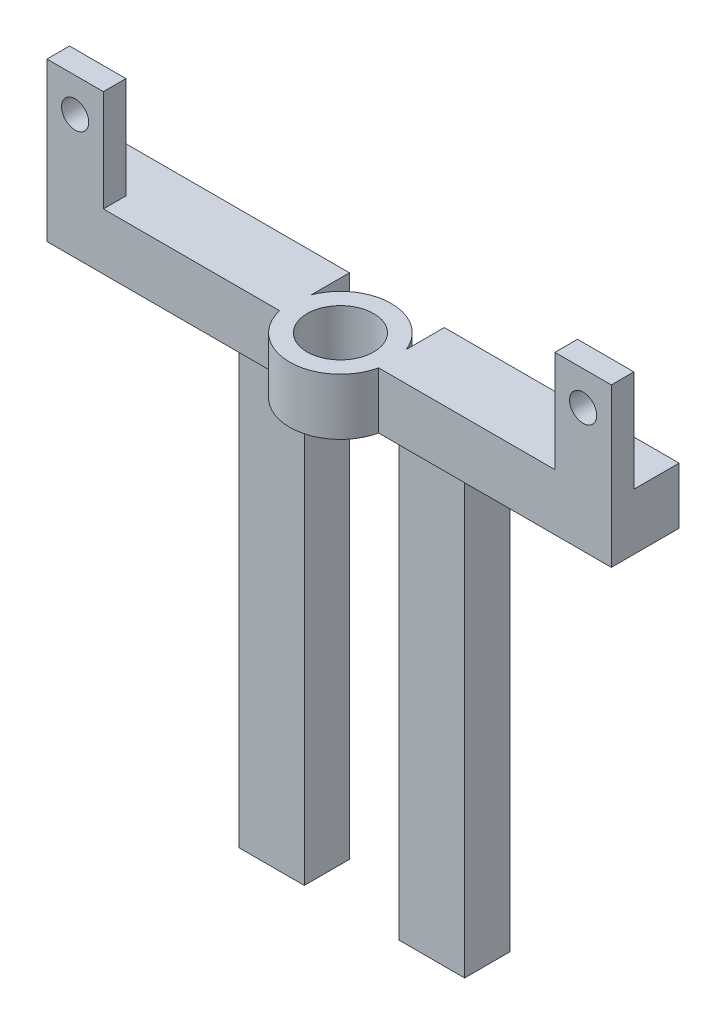
ISO-10303-21;
HEADER;
FILE_DESCRIPTION(('STEP AP214'),'2;1');
FILE_NAME('part.step','',(''),(''),'','','');
FILE_SCHEMA(('AUTOMOTIVE_DESIGN { 1 0 10303 214 1 1 1 1 }'));
ENDSEC;
DATA;
#1=APPLICATION_CONTEXT('core data for automotive mechanical design processes');
#2=APPLICATION_PROTOCOL_DEFINITION('international standard','automotive_design',2000,#1);
#3=PRODUCT_CONTEXT('',#1,'mechanical');
#4=PRODUCT('Part','Part','',(#3));
#5=PRODUCT_RELATED_PRODUCT_CATEGORY('part','',(#4));
#6=PRODUCT_DEFINITION_FORMATION('','',#4);
#7=PRODUCT_DEFINITION_CONTEXT('part definition',#1,'design');
#8=PRODUCT_DEFINITION('design','',#6,#7);
#9=PRODUCT_DEFINITION_SHAPE('','',#8);
#10=(LENGTH_UNIT() NAMED_UNIT(*) SI_UNIT(.MILLI.,.METRE.));
#11=(NAMED_UNIT(*) PLANE_ANGLE_UNIT() SI_UNIT($,.RADIAN.));
#12=(NAMED_UNIT(*) SI_UNIT($,.STERADIAN.) SOLID_ANGLE_UNIT());
#13=UNCERTAINTY_MEASURE_WITH_UNIT(LENGTH_MEASURE(1.E-05),#10,'distance_accuracy_value','');
#14=(GEOMETRIC_REPRESENTATION_CONTEXT(3) GLOBAL_UNCERTAINTY_ASSIGNED_CONTEXT((#13)) GLOBAL_UNIT_ASSIGNED_CONTEXT((#10,
#11,#12)) REPRESENTATION_CONTEXT('',''));
#15=CARTESIAN_POINT('',(0.,0.,0.));
#16=DIRECTION('',(0.,0.,1.));
#17=DIRECTION('',(1.,0.,0.));
#18=AXIS2_PLACEMENT_3D('',#15,#16,#17);
#19=CARTESIAN_POINT('',(0.,0.,0.));
#20=DIRECTION('',(0.,0.,1.));
#21=DIRECTION('',(1.,0.,0.));
#22=AXIS2_PLACEMENT_3D('',#19,#20,#21);
#23=PLANE('',#22);
#24=CARTESIAN_POINT('',(-22.5,-20.75,0.));
#25=DIRECTION('',(0.,0.,1.));
#26=DIRECTION('',(1.,0.,0.));
#27=AXIS2_PLACEMENT_3D('',#24,#25,#26);
#28=CIRCLE('',#27,1.2);
#29=CARTESIAN_POINT('',(-21.3,-20.75,0.));
#30=VERTEX_POINT('',#29);
#31=EDGE_CURVE('E304',#30,#30,#28,.T.);
#32=ORIENTED_EDGE('',*,*,#31,.T.);
#33=EDGE_LOOP('',(#32));
#34=FACE_BOUND('',#33,.T.);
#35=DIRECTION('',(1.,0.,0.));
#36=VECTOR('',#35,1.);
#37=CARTESIAN_POINT('',(0.,-26.75,0.));
#38=LINE('',#37,#36);
#39=CARTESIAN_POINT('',(-25.,-26.75,0.));
#40=VERTEX_POINT('',#39);
#41=CARTESIAN_POINT('',(-20.,-26.75,0.));
#42=VERTEX_POINT('',#41);
#43=EDGE_CURVE('E267',#40,#42,#38,.T.);
#44=ORIENTED_EDGE('',*,*,#43,.F.);
#45=DIRECTION('',(0.,1.,0.));
#46=VECTOR('',#45,1.);
#47=CARTESIAN_POINT('',(-25.,0.,0.));
#48=LINE('',#47,#46);
#49=CARTESIAN_POINT('',(-25.,-17.75,0.));
#50=VERTEX_POINT('',#49);
#51=EDGE_CURVE('E357',#40,#50,#48,.T.);
#52=ORIENTED_EDGE('',*,*,#51,.T.);
#53=DIRECTION('',(1.,0.,0.));
#54=VECTOR('',#53,1.);
#55=CARTESIAN_POINT('',(0.,-17.75,0.));
#56=LINE('',#55,#54);
#57=CARTESIAN_POINT('',(-20.,-17.75,0.));
#58=VERTEX_POINT('',#57);
#59=EDGE_CURVE('E321',#50,#58,#56,.T.);
#60=ORIENTED_EDGE('',*,*,#59,.T.);
#61=DIRECTION('',(0.,-1.,0.));
#62=VECTOR('',#61,1.);
#63=CARTESIAN_POINT('',(-20.,0.,0.));
#64=LINE('',#63,#62);
#65=EDGE_CURVE('E314',#58,#42,#64,.T.);
#66=ORIENTED_EDGE('',*,*,#65,.T.);
#67=EDGE_LOOP('',(#44,#52,#60,#66));
#68=FACE_BOUND('',#67,.T.);
#69=ADVANCED_FACE('F39',(#34,#68),#23,.F.);
#70=CARTESIAN_POINT('',(0.,0.,2.));
#71=DIRECTION('',(0.,0.,1.));
#72=DIRECTION('',(1.,0.,0.));
#73=AXIS2_PLACEMENT_3D('',#70,#71,#72);
#74=PLANE('',#73);
#75=DIRECTION('',(0.,1.,0.));
#76=VECTOR('',#75,1.);
#77=CARTESIAN_POINT('',(4.38748219369606,-44.4779220613579,2.));
#78=LINE('',#77,#76);
#79=CARTESIAN_POINT('',(4.38748219369607,-31.75,2.));
#80=VERTEX_POINT('',#79);
#81=CARTESIAN_POINT('',(4.38748219369607,-26.75,2.));
#82=VERTEX_POINT('',#81);
#83=EDGE_CURVE('E301',#80,#82,#78,.T.);
#84=ORIENTED_EDGE('',*,*,#83,.F.);
#85=DIRECTION('',(-1.,0.,0.));
#86=VECTOR('',#85,1.);
#87=CARTESIAN_POINT('',(0.,-31.75,2.));
#88=LINE('',#87,#86);
#89=CARTESIAN_POINT('',(25.,-31.75,2.));
#90=VERTEX_POINT('',#89);
#91=EDGE_CURVE('E335',#90,#80,#88,.T.);
#92=ORIENTED_EDGE('',*,*,#91,.F.);
#93=DIRECTION('',(0.,-1.,0.));
#94=VECTOR('',#93,1.);
#95=CARTESIAN_POINT('',(25.,0.,2.));
#96=LINE('',#95,#94);
#97=CARTESIAN_POINT('',(25.,-17.75,2.));
#98=VERTEX_POINT('',#97);
#99=EDGE_CURVE('E331',#98,#90,#96,.T.);
#100=ORIENTED_EDGE('',*,*,#99,.F.);
#101=DIRECTION('',(1.,0.,0.));
#102=VECTOR('',#101,1.);
#103=CARTESIAN_POINT('',(0.,-17.75,2.));
#104=LINE('',#103,#102);
#105=CARTESIAN_POINT('',(20.,-17.75,2.));
#106=VERTEX_POINT('',#105);
#107=EDGE_CURVE('E328',#106,#98,#104,.T.);
#108=ORIENTED_EDGE('',*,*,#107,.F.);
#109=DIRECTION('',(0.,1.,0.));
#110=VECTOR('',#109,1.);
#111=CARTESIAN_POINT('',(20.,0.,2.));
#112=LINE('',#111,#110);
#113=CARTESIAN_POINT('',(20.,-26.75,2.));
#114=VERTEX_POINT('',#113);
#115=EDGE_CURVE('E325',#114,#106,#112,.T.);
#116=ORIENTED_EDGE('',*,*,#115,.F.);
#117=DIRECTION('',(1.,0.,0.));
#118=VECTOR('',#117,1.);
#119=CARTESIAN_POINT('',(0.,-26.75,2.));
#120=LINE('',#119,#118);
#121=EDGE_CURVE('E320',#82,#114,#120,.T.);
#122=ORIENTED_EDGE('',*,*,#121,.F.);
#123=EDGE_LOOP('',(#84,#92,#100,#108,#116,#122));
#124=FACE_BOUND('',#123,.T.);
#125=CARTESIAN_POINT('',(22.5,-20.75,2.));
#126=DIRECTION('',(0.,0.,1.));
#127=DIRECTION('',(1.,0.,0.));
#128=AXIS2_PLACEMENT_3D('',#125,#126,#127);
#129=CIRCLE('',#128,1.2);
#130=CARTESIAN_POINT('',(23.7,-20.75,2.));
#131=VERTEX_POINT('',#130);
#132=EDGE_CURVE('E311',#131,#131,#129,.T.);
#133=ORIENTED_EDGE('',*,*,#132,.F.);
#134=EDGE_LOOP('',(#133));
#135=FACE_BOUND('',#134,.T.);
#136=ADVANCED_FACE('F404',(#124,#135),#74,.T.);
#137=CARTESIAN_POINT('',(22.5,-20.75,0.));
#138=DIRECTION('',(0.,0.,1.));
#139=DIRECTION('',(1.,0.,0.));
#140=AXIS2_PLACEMENT_3D('',#137,#138,#139);
#141=CIRCLE('',#140,1.2);
#142=CARTESIAN_POINT('',(23.7,-20.75,0.));
#143=VERTEX_POINT('',#142);
#144=EDGE_CURVE('E308',#143,#143,#141,.T.);
#145=ORIENTED_EDGE('',*,*,#144,.T.);
#146=EDGE_LOOP('',(#145));
#147=FACE_BOUND('',#146,.T.);
#148=DIRECTION('',(0.,-1.,0.));
#149=VECTOR('',#148,1.);
#150=CARTESIAN_POINT('',(25.,0.,0.));
#151=LINE('',#150,#149);
#152=CARTESIAN_POINT('',(25.,-17.75,0.));
#153=VERTEX_POINT('',#152);
#154=CARTESIAN_POINT('',(25.,-26.75,0.));
#155=VERTEX_POINT('',#154);
#156=EDGE_CURVE('E353',#153,#155,#151,.T.);
#157=ORIENTED_EDGE('',*,*,#156,.T.);
#158=DIRECTION('',(-1.,0.,0.));
#159=VECTOR('',#158,1.);
#160=CARTESIAN_POINT('',(0.,-26.75,0.));
#161=LINE('',#160,#159);
#162=CARTESIAN_POINT('',(20.,-26.75,0.));
#163=VERTEX_POINT('',#162);
#164=EDGE_CURVE('E263',#155,#163,#161,.T.);
#165=ORIENTED_EDGE('',*,*,#164,.T.);
#166=DIRECTION('',(0.,1.,0.));
#167=VECTOR('',#166,1.);
#168=CARTESIAN_POINT('',(20.,0.,0.));
#169=LINE('',#168,#167);
#170=CARTESIAN_POINT('',(20.,-17.75,0.));
#171=VERTEX_POINT('',#170);
#172=EDGE_CURVE('E347',#163,#171,#169,.T.);
#173=ORIENTED_EDGE('',*,*,#172,.T.);
#174=DIRECTION('',(1.,0.,0.));
#175=VECTOR('',#174,1.);
#176=CARTESIAN_POINT('',(0.,-17.75,0.));
#177=LINE('',#176,#175);
#178=EDGE_CURVE('E350',#171,#153,#177,.T.);
#179=ORIENTED_EDGE('',*,*,#178,.T.);
#180=EDGE_LOOP('',(#157,#165,#173,#179));
#181=FACE_BOUND('',#180,.T.);
#182=ADVANCED_FACE('F419',(#147,#181),#23,.F.);
#183=DIRECTION('',(0.,1.,0.));
#184=VECTOR('',#183,1.);
#185=CARTESIAN_POINT('',(-4.38748219369606,-44.4779220613579,2.));
#186=LINE('',#185,#184);
#187=CARTESIAN_POINT('',(-4.38748219369606,-26.75,2.));
#188=VERTEX_POINT('',#187);
#189=CARTESIAN_POINT('',(-4.38748219369606,-31.75,2.));
#190=VERTEX_POINT('',#189);
#191=EDGE_CURVE('E298',#188,#190,#186,.F.);
#192=ORIENTED_EDGE('',*,*,#191,.F.);
#193=CARTESIAN_POINT('',(-20.,-26.75,2.));
#194=VERTEX_POINT('',#193);
#195=EDGE_CURVE('E322',#194,#188,#120,.T.);
#196=ORIENTED_EDGE('',*,*,#195,.F.);
#197=DIRECTION('',(0.,-1.,0.));
#198=VECTOR('',#197,1.);
#199=CARTESIAN_POINT('',(-20.,0.,2.));
#200=LINE('',#199,#198);
#201=CARTESIAN_POINT('',(-20.,-17.75,2.));
#202=VERTEX_POINT('',#201);
#203=EDGE_CURVE('E317',#202,#194,#200,.T.);
#204=ORIENTED_EDGE('',*,*,#203,.F.);
#205=DIRECTION('',(1.,0.,0.));
#206=VECTOR('',#205,1.);
#207=CARTESIAN_POINT('',(0.,-17.75,2.));
#208=LINE('',#207,#206);
#209=CARTESIAN_POINT('',(-25.,-17.75,2.));
#210=VERTEX_POINT('',#209);
#211=EDGE_CURVE('E341',#210,#202,#208,.T.);
#212=ORIENTED_EDGE('',*,*,#211,.F.);
#213=DIRECTION('',(0.,1.,0.));
#214=VECTOR('',#213,1.);
#215=CARTESIAN_POINT('',(-25.,0.,2.));
#216=LINE('',#215,#214);
#217=CARTESIAN_POINT('',(-25.,-31.75,2.));
#218=VERTEX_POINT('',#217);
#219=EDGE_CURVE('E338',#218,#210,#216,.T.);
#220=ORIENTED_EDGE('',*,*,#219,.F.);
#221=EDGE_CURVE('E334',#190,#218,#88,.T.);
#222=ORIENTED_EDGE('',*,*,#221,.F.);
#223=EDGE_LOOP('',(#192,#196,#204,#212,#220,#222));
#224=FACE_BOUND('',#223,.T.);
#225=CARTESIAN_POINT('',(-22.5,-20.75,2.));
#226=DIRECTION('',(0.,0.,1.));
#227=DIRECTION('',(1.,0.,0.));
#228=AXIS2_PLACEMENT_3D('',#225,#226,#227);
#229=CIRCLE('',#228,1.2);
#230=CARTESIAN_POINT('',(-21.3,-20.75,2.));
#231=VERTEX_POINT('',#230);
#232=EDGE_CURVE('E305',#231,#231,#229,.T.);
#233=ORIENTED_EDGE('',*,*,#232,.F.);
#234=EDGE_LOOP('',(#233));
#235=FACE_BOUND('',#234,.T.);
#236=ADVANCED_FACE('F421',(#224,#235),#74,.T.);
#237=CARTESIAN_POINT('',(-20.,0.,2.));
#238=DIRECTION('',(1.,0.,0.));
#239=DIRECTION('',(0.,0.,-1.));
#240=AXIS2_PLACEMENT_3D('',#237,#238,#239);
#241=PLANE('',#240);
#242=ORIENTED_EDGE('',*,*,#65,.F.);
#243=DIRECTION('',(0.,0.,-1.));
#244=VECTOR('',#243,1.);
#245=CARTESIAN_POINT('',(-20.,-17.75,2.));
#246=LINE('',#245,#244);
#247=EDGE_CURVE('E361',#202,#58,#246,.T.);
#248=ORIENTED_EDGE('',*,*,#247,.F.);
#249=ORIENTED_EDGE('',*,*,#203,.T.);
#250=DIRECTION('',(0.,0.,-1.));
#251=VECTOR('',#250,1.);
#252=CARTESIAN_POINT('',(-20.,-26.75,2.));
#253=LINE('',#252,#251);
#254=EDGE_CURVE('E344',#194,#42,#253,.T.);
#255=ORIENTED_EDGE('',*,*,#254,.T.);
#256=EDGE_LOOP('',(#242,#248,#249,#255));
#257=FACE_BOUND('',#256,.T.);
#258=ADVANCED_FACE('F41',(#257),#241,.T.);
#259=CARTESIAN_POINT('',(0.,-17.75,2.));
#260=DIRECTION('',(0.,1.,0.));
#261=DIRECTION('',(0.,0.,1.));
#262=AXIS2_PLACEMENT_3D('',#259,#260,#261);
#263=PLANE('',#262);
#264=ORIENTED_EDGE('',*,*,#59,.F.);
#265=DIRECTION('',(0.,0.,-1.));
#266=VECTOR('',#265,1.);
#267=CARTESIAN_POINT('',(-25.,-17.75,2.));
#268=LINE('',#267,#266);
#269=EDGE_CURVE('E363',#210,#50,#268,.T.);
#270=ORIENTED_EDGE('',*,*,#269,.F.);
#271=ORIENTED_EDGE('',*,*,#211,.T.);
#272=ORIENTED_EDGE('',*,*,#247,.T.);
#273=EDGE_LOOP('',(#264,#270,#271,#272));
#274=FACE_BOUND('',#273,.T.);
#275=ADVANCED_FACE('F449',(#274),#263,.T.);
#276=CARTESIAN_POINT('',(-25.,0.,2.));
#277=DIRECTION('',(-1.,0.,0.));
#278=DIRECTION('',(0.,-1.,0.));
#279=AXIS2_PLACEMENT_3D('',#276,#277,#278);
#280=PLANE('',#279);
#281=ORIENTED_EDGE('',*,*,#51,.F.);
#282=DIRECTION('',(0.,0.,1.));
#283=VECTOR('',#282,1.);
#284=CARTESIAN_POINT('',(-25.,-26.75,-19.8113883008419));
#285=LINE('',#284,#283);
#286=CARTESIAN_POINT('',(-25.,-26.75,-4.));
#287=VERTEX_POINT('',#286);
#288=EDGE_CURVE('E274',#287,#40,#285,.T.);
#289=ORIENTED_EDGE('',*,*,#288,.F.);
#290=DIRECTION('',(0.,-1.,0.));
#291=VECTOR('',#290,1.);
#292=CARTESIAN_POINT('',(-25.,0.,-4.));
#293=LINE('',#292,#291);
#294=CARTESIAN_POINT('',(-25.,-31.75,-4.));
#295=VERTEX_POINT('',#294);
#296=EDGE_CURVE('E283',#287,#295,#293,.T.);
#297=ORIENTED_EDGE('',*,*,#296,.T.);
#298=DIRECTION('',(0.,0.,-1.));
#299=VECTOR('',#298,1.);
#300=CARTESIAN_POINT('',(-25.,-31.75,2.));
#301=LINE('',#300,#299);
#302=EDGE_CURVE('E366',#218,#295,#301,.T.);
#303=ORIENTED_EDGE('',*,*,#302,.F.);
#304=ORIENTED_EDGE('',*,*,#219,.T.);
#305=ORIENTED_EDGE('',*,*,#269,.T.);
#306=EDGE_LOOP('',(#281,#289,#297,#303,#304,#305));
#307=FACE_BOUND('',#306,.T.);
#308=ADVANCED_FACE('F443',(#307),#280,.T.);
#309=CARTESIAN_POINT('',(0.,-31.75,2.));
#310=DIRECTION('',(0.,-1.,0.));
#311=DIRECTION('',(1.,0.,0.));
#312=AXIS2_PLACEMENT_3D('',#309,#310,#311);
#313=PLANE('',#312);
#314=DIRECTION('',(0.,0.,-1.));
#315=VECTOR('',#314,1.);
#316=CARTESIAN_POINT('',(4.2,-31.75,2.));
#317=LINE('',#316,#315);
#318=CARTESIAN_POINT('',(4.2,-31.75,0.));
#319=VERTEX_POINT('',#318);
#320=CARTESIAN_POINT('',(4.2,-31.75,-0.615549442140364));
#321=VERTEX_POINT('',#320);
#322=EDGE_CURVE('E254',#319,#321,#317,.T.);
#323=ORIENTED_EDGE('',*,*,#322,.F.);
#324=DIRECTION('',(-1.,0.,0.));
#325=VECTOR('',#324,1.);
#326=CARTESIAN_POINT('',(0.,-31.75,0.));
#327=LINE('',#326,#325);
#328=CARTESIAN_POINT('',(10.,-31.75,0.));
#329=VERTEX_POINT('',#328);
#330=EDGE_CURVE('E355',#329,#319,#327,.T.);
#331=ORIENTED_EDGE('',*,*,#330,.F.);
#332=DIRECTION('',(0.,0.,1.));
#333=VECTOR('',#332,1.);
#334=CARTESIAN_POINT('',(10.,-31.75,-19.8113883008419));
#335=LINE('',#334,#333);
#336=CARTESIAN_POINT('',(10.,-31.75,-4.));
#337=VERTEX_POINT('',#336);
#338=EDGE_CURVE('E193',#337,#329,#335,.T.);
#339=ORIENTED_EDGE('',*,*,#338,.F.);
#340=DIRECTION('',(-1.,0.,0.));
#341=VECTOR('',#340,1.);
#342=CARTESIAN_POINT('',(0.,-31.75,-4.));
#343=LINE('',#342,#341);
#344=CARTESIAN_POINT('',(25.,-31.75,-4.));
#345=VERTEX_POINT('',#344);
#346=EDGE_CURVE('E259',#345,#337,#343,.T.);
#347=ORIENTED_EDGE('',*,*,#346,.F.);
#348=DIRECTION('',(0.,0.,-1.));
#349=VECTOR('',#348,1.);
#350=CARTESIAN_POINT('',(25.,-31.75,2.));
#351=LINE('',#350,#349);
#352=EDGE_CURVE('E368',#90,#345,#351,.T.);
#353=ORIENTED_EDGE('',*,*,#352,.F.);
#354=ORIENTED_EDGE('',*,*,#91,.T.);
#355=CARTESIAN_POINT('',(0.,-31.75,1.));
#356=DIRECTION('',(0.,-1.,0.));
#357=DIRECTION('',(1.,0.,0.));
#358=AXIS2_PLACEMENT_3D('',#355,#356,#357);
#359=CIRCLE('',#358,4.5);
#360=EDGE_CURVE('E294',#190,#80,#359,.F.);
#361=ORIENTED_EDGE('',*,*,#360,.F.);
#362=ORIENTED_EDGE('',*,*,#221,.T.);
#363=ORIENTED_EDGE('',*,*,#302,.T.);
#364=DIRECTION('',(1.,0.,0.));
#365=VECTOR('',#364,1.);
#366=CARTESIAN_POINT('',(0.,-31.75,-4.));
#367=LINE('',#366,#365);
#368=CARTESIAN_POINT('',(-9.99999999999999,-31.75,-4.));
#369=VERTEX_POINT('',#368);
#370=EDGE_CURVE('E256',#295,#369,#367,.T.);
#371=ORIENTED_EDGE('',*,*,#370,.T.);
#372=DIRECTION('',(0.,0.,1.));
#373=VECTOR('',#372,1.);
#374=CARTESIAN_POINT('',(-9.99999999999999,-31.75,-19.8113883008419));
#375=LINE('',#374,#373);
#376=CARTESIAN_POINT('',(-9.99999999999999,-31.75,0.));
#377=VERTEX_POINT('',#376);
#378=EDGE_CURVE('E277',#369,#377,#375,.T.);
#379=ORIENTED_EDGE('',*,*,#378,.T.);
#380=CARTESIAN_POINT('',(-4.19999999999999,-31.75,0.));
#381=VERTEX_POINT('',#380);
#382=EDGE_CURVE('E54',#381,#377,#327,.T.);
#383=ORIENTED_EDGE('',*,*,#382,.F.);
#384=DIRECTION('',(0.,0.,1.));
#385=VECTOR('',#384,1.);
#386=CARTESIAN_POINT('',(-4.19999999999999,-31.75,2.));
#387=LINE('',#386,#385);
#388=CARTESIAN_POINT('',(-4.19999999999999,-31.75,-0.615549442140364));
#389=VERTEX_POINT('',#388);
#390=EDGE_CURVE('E222',#389,#381,#387,.T.);
#391=ORIENTED_EDGE('',*,*,#390,.F.);
#392=EDGE_CURVE('E296',#321,#389,#359,.F.);
#393=ORIENTED_EDGE('',*,*,#392,.F.);
#394=EDGE_LOOP('',(#323,#331,#339,#347,#353,#354,#361,#362,#363,#371,#379,#383,#391,#393));
#395=FACE_BOUND('',#394,.T.);
#396=CARTESIAN_POINT('',(0.,-31.75,1.));
#397=DIRECTION('',(0.,1.,0.));
#398=DIRECTION('',(0.,0.,1.));
#399=AXIS2_PLACEMENT_3D('',#396,#397,#398);
#400=CIRCLE('',#399,2.95);
#401=CARTESIAN_POINT('',(0.,-31.75,3.95));
#402=VERTEX_POINT('',#401);
#403=EDGE_CURVE('E273',#402,#402,#400,.T.);
#404=ORIENTED_EDGE('',*,*,#403,.T.);
#405=EDGE_LOOP('',(#404));
#406=FACE_BOUND('',#405,.T.);
#407=ADVANCED_FACE('F391',(#395,#406),#313,.T.);
#408=CARTESIAN_POINT('',(25.,0.,2.));
#409=DIRECTION('',(1.,0.,0.));
#410=DIRECTION('',(0.,1.,0.));
#411=AXIS2_PLACEMENT_3D('',#408,#409,#410);
#412=PLANE('',#411);
#413=ORIENTED_EDGE('',*,*,#156,.F.);
#414=DIRECTION('',(0.,0.,-1.));
#415=VECTOR('',#414,1.);
#416=CARTESIAN_POINT('',(25.,-17.75,2.));
#417=LINE('',#416,#415);
#418=EDGE_CURVE('E370',#98,#153,#417,.T.);
#419=ORIENTED_EDGE('',*,*,#418,.F.);
#420=ORIENTED_EDGE('',*,*,#99,.T.);
#421=ORIENTED_EDGE('',*,*,#352,.T.);
#422=DIRECTION('',(0.,-1.,0.));
#423=VECTOR('',#422,1.);
#424=CARTESIAN_POINT('',(25.,0.,-4.));
#425=LINE('',#424,#423);
#426=CARTESIAN_POINT('',(25.,-26.75,-4.));
#427=VERTEX_POINT('',#426);
#428=EDGE_CURVE('E262',#427,#345,#425,.T.);
#429=ORIENTED_EDGE('',*,*,#428,.F.);
#430=DIRECTION('',(0.,0.,1.));
#431=VECTOR('',#430,1.);
#432=CARTESIAN_POINT('',(25.,-26.75,-19.8113883008419));
#433=LINE('',#432,#431);
#434=EDGE_CURVE('E266',#427,#155,#433,.T.);
#435=ORIENTED_EDGE('',*,*,#434,.T.);
#436=EDGE_LOOP('',(#413,#419,#420,#421,#429,#435));
#437=FACE_BOUND('',#436,.T.);
#438=ADVANCED_FACE('F408',(#437),#412,.T.);
#439=CARTESIAN_POINT('',(0.,-17.75,2.));
#440=DIRECTION('',(0.,1.,0.));
#441=DIRECTION('',(-1.,0.,0.));
#442=AXIS2_PLACEMENT_3D('',#439,#440,#441);
#443=PLANE('',#442);
#444=ORIENTED_EDGE('',*,*,#178,.F.);
#445=DIRECTION('',(0.,0.,-1.));
#446=VECTOR('',#445,1.);
#447=CARTESIAN_POINT('',(20.,-17.75,2.));
#448=LINE('',#447,#446);
#449=EDGE_CURVE('E372',#106,#171,#448,.T.);
#450=ORIENTED_EDGE('',*,*,#449,.F.);
#451=ORIENTED_EDGE('',*,*,#107,.T.);
#452=ORIENTED_EDGE('',*,*,#418,.T.);
#453=EDGE_LOOP('',(#444,#450,#451,#452));
#454=FACE_BOUND('',#453,.T.);
#455=ADVANCED_FACE('F411',(#454),#443,.T.);
#456=CARTESIAN_POINT('',(20.,0.,2.));
#457=DIRECTION('',(-1.,0.,0.));
#458=DIRECTION('',(0.,0.,1.));
#459=AXIS2_PLACEMENT_3D('',#456,#457,#458);
#460=PLANE('',#459);
#461=ORIENTED_EDGE('',*,*,#172,.F.);
#462=DIRECTION('',(0.,0.,-1.));
#463=VECTOR('',#462,1.);
#464=CARTESIAN_POINT('',(20.,-26.75,2.));
#465=LINE('',#464,#463);
#466=EDGE_CURVE('E374',#114,#163,#465,.T.);
#467=ORIENTED_EDGE('',*,*,#466,.F.);
#468=ORIENTED_EDGE('',*,*,#115,.T.);
#469=ORIENTED_EDGE('',*,*,#449,.T.);
#470=EDGE_LOOP('',(#461,#467,#468,#469));
#471=FACE_BOUND('',#470,.T.);
#472=ADVANCED_FACE('F415',(#471),#460,.T.);
#473=CARTESIAN_POINT('',(0.,-26.75,2.));
#474=DIRECTION('',(0.,1.,0.));
#475=DIRECTION('',(-1.,0.,0.));
#476=AXIS2_PLACEMENT_3D('',#473,#474,#475);
#477=PLANE('',#476);
#478=CARTESIAN_POINT('',(0.,-26.75,1.));
#479=DIRECTION('',(0.,1.,0.));
#480=DIRECTION('',(-1.,0.,0.));
#481=AXIS2_PLACEMENT_3D('',#478,#479,#480);
#482=CIRCLE('',#481,4.5);
#483=CARTESIAN_POINT('',(4.2,-26.75,-0.61554944214036));
#484=VERTEX_POINT('',#483);
#485=CARTESIAN_POINT('',(-4.19999999999999,-26.75,-0.61554944214036));
#486=VERTEX_POINT('',#485);
#487=EDGE_CURVE('E295',#484,#486,#482,.T.);
#488=ORIENTED_EDGE('',*,*,#487,.T.);
#489=DIRECTION('',(0.,0.,-1.));
#490=VECTOR('',#489,1.);
#491=CARTESIAN_POINT('',(-4.19999999999999,-26.75,2.));
#492=LINE('',#491,#490);
#493=CARTESIAN_POINT('',(-4.19999999999999,-26.75,-4.));
#494=VERTEX_POINT('',#493);
#495=EDGE_CURVE('E216',#486,#494,#492,.T.);
#496=ORIENTED_EDGE('',*,*,#495,.T.);
#497=DIRECTION('',(-1.,0.,0.));
#498=VECTOR('',#497,1.);
#499=CARTESIAN_POINT('',(0.,-26.75,-4.));
#500=LINE('',#499,#498);
#501=EDGE_CURVE('E278',#494,#287,#500,.T.);
#502=ORIENTED_EDGE('',*,*,#501,.T.);
#503=ORIENTED_EDGE('',*,*,#288,.T.);
#504=ORIENTED_EDGE('',*,*,#43,.T.);
#505=ORIENTED_EDGE('',*,*,#254,.F.);
#506=ORIENTED_EDGE('',*,*,#195,.T.);
#507=EDGE_CURVE('E291',#188,#82,#482,.T.);
#508=ORIENTED_EDGE('',*,*,#507,.T.);
#509=ORIENTED_EDGE('',*,*,#121,.T.);
#510=ORIENTED_EDGE('',*,*,#466,.T.);
#511=ORIENTED_EDGE('',*,*,#164,.F.);
#512=ORIENTED_EDGE('',*,*,#434,.F.);
#513=DIRECTION('',(1.,0.,0.));
#514=VECTOR('',#513,1.);
#515=CARTESIAN_POINT('',(0.,-26.75,-4.));
#516=LINE('',#515,#514);
#517=CARTESIAN_POINT('',(4.2,-26.75,-4.));
#518=VERTEX_POINT('',#517);
#519=EDGE_CURVE('E257',#518,#427,#516,.T.);
#520=ORIENTED_EDGE('',*,*,#519,.F.);
#521=DIRECTION('',(0.,0.,1.));
#522=VECTOR('',#521,1.);
#523=CARTESIAN_POINT('',(4.2,-26.75,2.));
#524=LINE('',#523,#522);
#525=EDGE_CURVE('E213',#518,#484,#524,.T.);
#526=ORIENTED_EDGE('',*,*,#525,.T.);
#527=EDGE_LOOP('',(#488,#496,#502,#503,#504,#505,#506,#508,#509,#510,#511,#512,#520,#526));
#528=FACE_BOUND('',#527,.T.);
#529=CARTESIAN_POINT('',(0.,-26.75,1.));
#530=DIRECTION('',(0.,1.,0.));
#531=DIRECTION('',(-1.,0.,0.));
#532=AXIS2_PLACEMENT_3D('',#529,#530,#531);
#533=CIRCLE('',#532,2.95);
#534=CARTESIAN_POINT('',(-2.95,-26.75,1.));
#535=VERTEX_POINT('',#534);
#536=EDGE_CURVE('E290',#535,#535,#533,.T.);
#537=ORIENTED_EDGE('',*,*,#536,.F.);
#538=EDGE_LOOP('',(#537));
#539=FACE_BOUND('',#538,.T.);
#540=ADVANCED_FACE('F383',(#528,#539),#477,.T.);
#541=CARTESIAN_POINT('',(22.5,-20.75,2.));
#542=DIRECTION('',(0.,0.,-1.));
#543=DIRECTION('',(-1.,0.,0.));
#544=AXIS2_PLACEMENT_3D('',#541,#542,#543);
#545=CYLINDRICAL_SURFACE('',#544,1.2);
#546=ORIENTED_EDGE('',*,*,#132,.T.);
#547=EDGE_LOOP('',(#546));
#548=FACE_BOUND('',#547,.T.);
#549=ORIENTED_EDGE('',*,*,#144,.F.);
#550=EDGE_LOOP('',(#549));
#551=FACE_BOUND('',#550,.T.);
#552=ADVANCED_FACE('F492',(#548,#551),#545,.F.);
#553=CARTESIAN_POINT('',(-22.5,-20.75,2.));
#554=DIRECTION('',(0.,0.,-1.));
#555=DIRECTION('',(-1.,0.,0.));
#556=AXIS2_PLACEMENT_3D('',#553,#554,#555);
#557=CYLINDRICAL_SURFACE('',#556,1.2);
#558=ORIENTED_EDGE('',*,*,#232,.T.);
#559=EDGE_LOOP('',(#558));
#560=FACE_BOUND('',#559,.T.);
#561=ORIENTED_EDGE('',*,*,#31,.F.);
#562=EDGE_LOOP('',(#561));
#563=FACE_BOUND('',#562,.T.);
#564=ADVANCED_FACE('F489',(#560,#563),#557,.F.);
#565=CARTESIAN_POINT('',(0.,-44.4779220613579,1.));
#566=DIRECTION('',(0.,1.,0.));
#567=DIRECTION('',(0.,0.,1.));
#568=AXIS2_PLACEMENT_3D('',#565,#566,#567);
#569=CYLINDRICAL_SURFACE('',#568,4.5);
#570=DIRECTION('',(0.,1.,0.));
#571=VECTOR('',#570,1.);
#572=CARTESIAN_POINT('',(4.2,-44.4779220613579,-0.615549442140364));
#573=LINE('',#572,#571);
#574=EDGE_CURVE('E11',#321,#484,#573,.T.);
#575=ORIENTED_EDGE('',*,*,#574,.F.);
#576=ORIENTED_EDGE('',*,*,#392,.T.);
#577=DIRECTION('',(0.,1.,0.));
#578=VECTOR('',#577,1.);
#579=CARTESIAN_POINT('',(-4.19999999999999,-44.4779220613579,-0.615549442140364));
#580=LINE('',#579,#578);
#581=EDGE_CURVE('E47',#486,#389,#580,.F.);
#582=ORIENTED_EDGE('',*,*,#581,.F.);
#583=ORIENTED_EDGE('',*,*,#487,.F.);
#584=EDGE_LOOP('',(#575,#576,#582,#583));
#585=FACE_BOUND('',#584,.T.);
#586=ADVANCED_FACE('F387',(#585),#569,.T.);
#587=ORIENTED_EDGE('',*,*,#360,.T.);
#588=ORIENTED_EDGE('',*,*,#83,.T.);
#589=ORIENTED_EDGE('',*,*,#507,.F.);
#590=ORIENTED_EDGE('',*,*,#191,.T.);
#591=EDGE_LOOP('',(#587,#588,#589,#590));
#592=FACE_BOUND('',#591,.T.);
#593=ADVANCED_FACE('F456',(#592),#569,.T.);
#594=CARTESIAN_POINT('',(0.,-31.75,1.));
#595=DIRECTION('',(0.,1.,0.));
#596=DIRECTION('',(0.,0.,1.));
#597=AXIS2_PLACEMENT_3D('',#594,#595,#596);
#598=CYLINDRICAL_SURFACE('',#597,2.95);
#599=ORIENTED_EDGE('',*,*,#536,.T.);
#600=EDGE_LOOP('',(#599));
#601=FACE_BOUND('',#600,.T.);
#602=ORIENTED_EDGE('',*,*,#403,.F.);
#603=EDGE_LOOP('',(#602));
#604=FACE_BOUND('',#603,.T.);
#605=ADVANCED_FACE('F484',(#601,#604),#598,.F.);
#606=CARTESIAN_POINT('',(-13.6340601176843,21.5,-4.));
#607=DIRECTION('',(0.,0.,1.));
#608=DIRECTION('',(0.,-1.,0.));
#609=AXIS2_PLACEMENT_3D('',#606,#607,#608);
#610=PLANE('',#609);
#611=ORIENTED_EDGE('',*,*,#296,.F.);
#612=ORIENTED_EDGE('',*,*,#501,.F.);
#613=DIRECTION('',(0.,1.,0.));
#614=VECTOR('',#613,1.);
#615=CARTESIAN_POINT('',(-4.19999999999999,-71.75,-4.));
#616=LINE('',#615,#614);
#617=CARTESIAN_POINT('',(-4.19999999999999,-71.75,-4.));
#618=VERTEX_POINT('',#617);
#619=EDGE_CURVE('E237',#618,#494,#616,.T.);
#620=ORIENTED_EDGE('',*,*,#619,.F.);
#621=DIRECTION('',(-1.,0.,0.));
#622=VECTOR('',#621,1.);
#623=CARTESIAN_POINT('',(0.,-71.75,-4.));
#624=LINE('',#623,#622);
#625=CARTESIAN_POINT('',(-9.99999999999999,-71.75,-4.));
#626=VERTEX_POINT('',#625);
#627=EDGE_CURVE('E242',#618,#626,#624,.T.);
#628=ORIENTED_EDGE('',*,*,#627,.T.);
#629=DIRECTION('',(0.,1.,0.));
#630=VECTOR('',#629,1.);
#631=CARTESIAN_POINT('',(-9.99999999999999,-71.75,-4.));
#632=LINE('',#631,#630);
#633=EDGE_CURVE('E227',#626,#369,#632,.T.);
#634=ORIENTED_EDGE('',*,*,#633,.T.);
#635=ORIENTED_EDGE('',*,*,#370,.F.);
#636=EDGE_LOOP('',(#611,#612,#620,#628,#634,#635));
#637=FACE_BOUND('',#636,.T.);
#638=ADVANCED_FACE('F459',(#637),#610,.F.);
#639=CARTESIAN_POINT('',(-13.6340601176843,21.5,-4.));
#640=DIRECTION('',(0.,0.,1.));
#641=DIRECTION('',(0.,-1.,0.));
#642=AXIS2_PLACEMENT_3D('',#639,#640,#641);
#643=PLANE('',#642);
#644=ORIENTED_EDGE('',*,*,#346,.T.);
#645=DIRECTION('',(0.,1.,0.));
#646=VECTOR('',#645,1.);
#647=CARTESIAN_POINT('',(10.,-71.75,-4.));
#648=LINE('',#647,#646);
#649=CARTESIAN_POINT('',(10.,-71.75,-4.));
#650=VERTEX_POINT('',#649);
#651=EDGE_CURVE('E197',#650,#337,#648,.T.);
#652=ORIENTED_EDGE('',*,*,#651,.F.);
#653=DIRECTION('',(-1.,0.,0.));
#654=VECTOR('',#653,1.);
#655=CARTESIAN_POINT('',(0.,-71.75,-4.));
#656=LINE('',#655,#654);
#657=CARTESIAN_POINT('',(4.2,-71.75,-4.));
#658=VERTEX_POINT('',#657);
#659=EDGE_CURVE('E208',#650,#658,#656,.T.);
#660=ORIENTED_EDGE('',*,*,#659,.T.);
#661=DIRECTION('',(0.,1.,0.));
#662=VECTOR('',#661,1.);
#663=CARTESIAN_POINT('',(4.2,-71.75,-4.));
#664=LINE('',#663,#662);
#665=EDGE_CURVE('E223',#658,#518,#664,.T.);
#666=ORIENTED_EDGE('',*,*,#665,.T.);
#667=ORIENTED_EDGE('',*,*,#519,.T.);
#668=ORIENTED_EDGE('',*,*,#428,.T.);
#669=EDGE_LOOP('',(#644,#652,#660,#666,#667,#668));
#670=FACE_BOUND('',#669,.T.);
#671=ADVANCED_FACE('F395',(#670),#643,.F.);
#672=CARTESIAN_POINT('',(0.,-71.75,0.));
#673=DIRECTION('',(0.,0.,1.));
#674=DIRECTION('',(1.,0.,0.));
#675=AXIS2_PLACEMENT_3D('',#672,#673,#674);
#676=PLANE('',#675);
#677=DIRECTION('',(0.,1.,0.));
#678=VECTOR('',#677,1.);
#679=CARTESIAN_POINT('',(10.,-71.75,0.));
#680=LINE('',#679,#678);
#681=CARTESIAN_POINT('',(10.,-71.75,0.));
#682=VERTEX_POINT('',#681);
#683=EDGE_CURVE('E188',#682,#329,#680,.T.);
#684=ORIENTED_EDGE('',*,*,#683,.T.);
#685=ORIENTED_EDGE('',*,*,#330,.T.);
#686=DIRECTION('',(0.,1.,0.));
#687=VECTOR('',#686,1.);
#688=CARTESIAN_POINT('',(4.2,-71.75,0.));
#689=LINE('',#688,#687);
#690=CARTESIAN_POINT('',(4.2,-71.75,0.));
#691=VERTEX_POINT('',#690);
#692=EDGE_CURVE('E212',#691,#319,#689,.T.);
#693=ORIENTED_EDGE('',*,*,#692,.F.);
#694=DIRECTION('',(1.,0.,0.));
#695=VECTOR('',#694,1.);
#696=CARTESIAN_POINT('',(0.,-71.75,0.));
#697=LINE('',#696,#695);
#698=EDGE_CURVE('E205',#691,#682,#697,.T.);
#699=ORIENTED_EDGE('',*,*,#698,.T.);
#700=EDGE_LOOP('',(#684,#685,#693,#699));
#701=FACE_BOUND('',#700,.T.);
#702=ADVANCED_FACE('F210',(#701),#676,.T.);
#703=CARTESIAN_POINT('',(4.2,-71.75,2.));
#704=DIRECTION('',(-1.,0.,0.));
#705=DIRECTION('',(0.,0.,1.));
#706=AXIS2_PLACEMENT_3D('',#703,#704,#705);
#707=PLANE('',#706);
#708=ORIENTED_EDGE('',*,*,#692,.T.);
#709=ORIENTED_EDGE('',*,*,#322,.T.);
#710=ORIENTED_EDGE('',*,*,#574,.T.);
#711=ORIENTED_EDGE('',*,*,#525,.F.);
#712=ORIENTED_EDGE('',*,*,#665,.F.);
#713=DIRECTION('',(0.,0.,1.));
#714=VECTOR('',#713,1.);
#715=CARTESIAN_POINT('',(4.2,-71.75,2.));
#716=LINE('',#715,#714);
#717=EDGE_CURVE('E198',#658,#691,#716,.T.);
#718=ORIENTED_EDGE('',*,*,#717,.T.);
#719=EDGE_LOOP('',(#708,#709,#710,#711,#712,#718));
#720=FACE_BOUND('',#719,.T.);
#721=ADVANCED_FACE('F393',(#720),#707,.T.);
#722=CARTESIAN_POINT('',(10.,-71.75,2.));
#723=DIRECTION('',(1.,0.,0.));
#724=DIRECTION('',(0.,0.,-1.));
#725=AXIS2_PLACEMENT_3D('',#722,#723,#724);
#726=PLANE('',#725);
#727=ORIENTED_EDGE('',*,*,#651,.T.);
#728=ORIENTED_EDGE('',*,*,#338,.T.);
#729=ORIENTED_EDGE('',*,*,#683,.F.);
#730=DIRECTION('',(0.,0.,-1.));
#731=VECTOR('',#730,1.);
#732=CARTESIAN_POINT('',(10.,-71.75,2.));
#733=LINE('',#732,#731);
#734=EDGE_CURVE('E191',#682,#650,#733,.T.);
#735=ORIENTED_EDGE('',*,*,#734,.T.);
#736=EDGE_LOOP('',(#727,#728,#729,#735));
#737=FACE_BOUND('',#736,.T.);
#738=ADVANCED_FACE('F190',(#737),#726,.T.);
#739=CARTESIAN_POINT('',(0.,-71.75,0.));
#740=DIRECTION('',(0.,1.,0.));
#741=DIRECTION('',(-1.,0.,0.));
#742=AXIS2_PLACEMENT_3D('',#739,#740,#741);
#743=PLANE('',#742);
#744=ORIENTED_EDGE('',*,*,#698,.F.);
#745=ORIENTED_EDGE('',*,*,#717,.F.);
#746=ORIENTED_EDGE('',*,*,#659,.F.);
#747=ORIENTED_EDGE('',*,*,#734,.F.);
#748=EDGE_LOOP('',(#744,#745,#746,#747));
#749=FACE_BOUND('',#748,.T.);
#750=ADVANCED_FACE('F203',(#749),#743,.F.);
#751=CARTESIAN_POINT('',(-4.19999999999999,-71.75,2.));
#752=DIRECTION('',(1.,0.,0.));
#753=DIRECTION('',(0.,0.,-1.));
#754=AXIS2_PLACEMENT_3D('',#751,#752,#753);
#755=PLANE('',#754);
#756=ORIENTED_EDGE('',*,*,#581,.T.);
#757=ORIENTED_EDGE('',*,*,#390,.T.);
#758=DIRECTION('',(0.,1.,0.));
#759=VECTOR('',#758,1.);
#760=CARTESIAN_POINT('',(-4.19999999999999,-71.75,0.));
#761=LINE('',#760,#759);
#762=CARTESIAN_POINT('',(-4.19999999999999,-71.75,0.));
#763=VERTEX_POINT('',#762);
#764=EDGE_CURVE('E234',#763,#381,#761,.T.);
#765=ORIENTED_EDGE('',*,*,#764,.F.);
#766=DIRECTION('',(0.,0.,-1.));
#767=VECTOR('',#766,1.);
#768=CARTESIAN_POINT('',(-4.19999999999999,-71.75,2.));
#769=LINE('',#768,#767);
#770=EDGE_CURVE('E230',#763,#618,#769,.T.);
#771=ORIENTED_EDGE('',*,*,#770,.T.);
#772=ORIENTED_EDGE('',*,*,#619,.T.);
#773=ORIENTED_EDGE('',*,*,#495,.F.);
#774=EDGE_LOOP('',(#756,#757,#765,#771,#772,#773));
#775=FACE_BOUND('',#774,.T.);
#776=ADVANCED_FACE('F381',(#775),#755,.T.);
#777=CARTESIAN_POINT('',(0.,-71.75,0.));
#778=DIRECTION('',(0.,0.,1.));
#779=DIRECTION('',(1.,0.,0.));
#780=AXIS2_PLACEMENT_3D('',#777,#778,#779);
#781=PLANE('',#780);
#782=ORIENTED_EDGE('',*,*,#764,.T.);
#783=ORIENTED_EDGE('',*,*,#382,.T.);
#784=DIRECTION('',(0.,1.,0.));
#785=VECTOR('',#784,1.);
#786=CARTESIAN_POINT('',(-9.99999999999999,-71.75,0.));
#787=LINE('',#786,#785);
#788=CARTESIAN_POINT('',(-9.99999999999999,-71.75,0.));
#789=VERTEX_POINT('',#788);
#790=EDGE_CURVE('E231',#789,#377,#787,.T.);
#791=ORIENTED_EDGE('',*,*,#790,.F.);
#792=DIRECTION('',(1.,0.,0.));
#793=VECTOR('',#792,1.);
#794=CARTESIAN_POINT('',(0.,-71.75,0.));
#795=LINE('',#794,#793);
#796=EDGE_CURVE('E245',#789,#763,#795,.T.);
#797=ORIENTED_EDGE('',*,*,#796,.T.);
#798=EDGE_LOOP('',(#782,#783,#791,#797));
#799=FACE_BOUND('',#798,.T.);
#800=ADVANCED_FACE('F466',(#799),#781,.T.);
#801=CARTESIAN_POINT('',(-9.99999999999999,-71.75,2.));
#802=DIRECTION('',(-1.,0.,0.));
#803=DIRECTION('',(0.,0.,1.));
#804=AXIS2_PLACEMENT_3D('',#801,#802,#803);
#805=PLANE('',#804);
#806=ORIENTED_EDGE('',*,*,#790,.T.);
#807=ORIENTED_EDGE('',*,*,#378,.F.);
#808=ORIENTED_EDGE('',*,*,#633,.F.);
#809=DIRECTION('',(0.,0.,1.));
#810=VECTOR('',#809,1.);
#811=CARTESIAN_POINT('',(-9.99999999999999,-71.75,2.));
#812=LINE('',#811,#810);
#813=EDGE_CURVE('E248',#626,#789,#812,.T.);
#814=ORIENTED_EDGE('',*,*,#813,.T.);
#815=EDGE_LOOP('',(#806,#807,#808,#814));
#816=FACE_BOUND('',#815,.T.);
#817=ADVANCED_FACE('F462',(#816),#805,.T.);
#818=CARTESIAN_POINT('',(0.,-71.75,0.));
#819=DIRECTION('',(0.,1.,0.));
#820=DIRECTION('',(-1.,0.,0.));
#821=AXIS2_PLACEMENT_3D('',#818,#819,#820);
#822=PLANE('',#821);
#823=ORIENTED_EDGE('',*,*,#627,.F.);
#824=ORIENTED_EDGE('',*,*,#770,.F.);
#825=ORIENTED_EDGE('',*,*,#796,.F.);
#826=ORIENTED_EDGE('',*,*,#813,.F.);
#827=EDGE_LOOP('',(#823,#824,#825,#826));
#828=FACE_BOUND('',#827,.T.);
#829=ADVANCED_FACE('F470',(#828),#822,.F.);
#830=CLOSED_SHELL('',(#69,#136,#182,#236,#258,#275,#308,#407,#438,#455,#472,#540,#552,#564,#586,
#593,#605,#638,#671,#702,#721,#738,#750,#776,#800,#817,#829));
#831=MANIFOLD_SOLID_BREP('B2',#830);
#832=ADVANCED_BREP_SHAPE_REPRESENTATION('',(#18,#831),#14);
#833=SHAPE_DEFINITION_REPRESENTATION(#9,#832);
ENDSEC;
END-ISO-10303-21;
